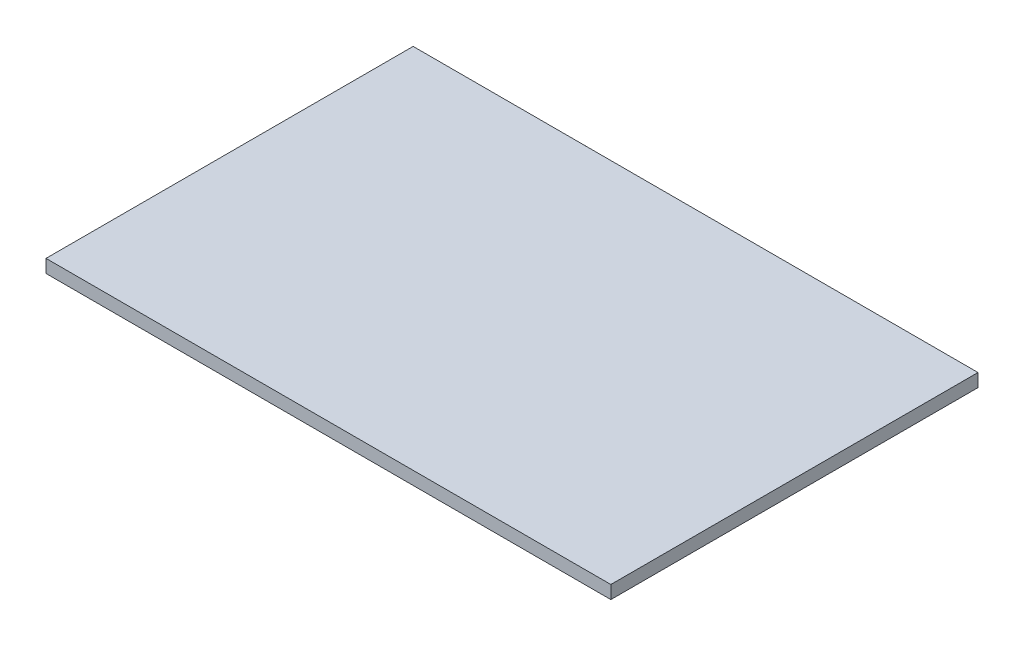
ISO-10303-21;
HEADER;
FILE_DESCRIPTION(('STEP AP214'),'2;1');
FILE_NAME('part.step','',(''),(''),'','','');
FILE_SCHEMA(('AUTOMOTIVE_DESIGN { 1 0 10303 214 1 1 1 1 }'));
ENDSEC;
DATA;
#1=APPLICATION_CONTEXT('core data for automotive mechanical design processes');
#2=APPLICATION_PROTOCOL_DEFINITION('international standard','automotive_design',2000,#1);
#3=PRODUCT_CONTEXT('',#1,'mechanical');
#4=PRODUCT('Part','Part','',(#3));
#5=PRODUCT_RELATED_PRODUCT_CATEGORY('part','',(#4));
#6=PRODUCT_DEFINITION_FORMATION('','',#4);
#7=PRODUCT_DEFINITION_CONTEXT('part definition',#1,'design');
#8=PRODUCT_DEFINITION('design','',#6,#7);
#9=PRODUCT_DEFINITION_SHAPE('','',#8);
#10=(LENGTH_UNIT() NAMED_UNIT(*) SI_UNIT(.MILLI.,.METRE.));
#11=(NAMED_UNIT(*) PLANE_ANGLE_UNIT() SI_UNIT($,.RADIAN.));
#12=(NAMED_UNIT(*) SI_UNIT($,.STERADIAN.) SOLID_ANGLE_UNIT());
#13=UNCERTAINTY_MEASURE_WITH_UNIT(LENGTH_MEASURE(1.E-05),#10,'distance_accuracy_value','');
#14=(GEOMETRIC_REPRESENTATION_CONTEXT(3) GLOBAL_UNCERTAINTY_ASSIGNED_CONTEXT((#13)) GLOBAL_UNIT_ASSIGNED_CONTEXT((#10,
#11,#12)) REPRESENTATION_CONTEXT('',''));
#15=CARTESIAN_POINT('',(0.,0.,0.));
#16=DIRECTION('',(0.,0.,1.));
#17=DIRECTION('',(1.,0.,0.));
#18=AXIS2_PLACEMENT_3D('',#15,#16,#17);
#19=CARTESIAN_POINT('',(0.,-0.7366,0.));
#20=DIRECTION('',(-1.,0.,0.));
#21=DIRECTION('',(0.,0.,1.));
#22=AXIS2_PLACEMENT_3D('',#19,#20,#21);
#23=PLANE('',#22);
#24=DIRECTION('',(0.,0.,1.));
#25=VECTOR('',#24,1.);
#26=CARTESIAN_POINT('',(0.,0.,0.));
#27=LINE('',#26,#25);
#28=CARTESIAN_POINT('',(0.,0.,-20.6375));
#29=VERTEX_POINT('',#28);
#30=CARTESIAN_POINT('',(0.,0.,0.));
#31=VERTEX_POINT('',#30);
#32=EDGE_CURVE('E99',#29,#31,#27,.T.);
#33=ORIENTED_EDGE('',*,*,#32,.F.);
#34=DIRECTION('',(0.,1.,0.));
#35=VECTOR('',#34,1.);
#36=CARTESIAN_POINT('',(0.,-0.7366,-20.6375));
#37=LINE('',#36,#35);
#38=CARTESIAN_POINT('',(0.,-0.7366,-20.6375));
#39=VERTEX_POINT('',#38);
#40=EDGE_CURVE('E11',#39,#29,#37,.T.);
#41=ORIENTED_EDGE('',*,*,#40,.F.);
#42=DIRECTION('',(0.,0.,1.));
#43=VECTOR('',#42,1.);
#44=CARTESIAN_POINT('',(0.,-0.7366,0.));
#45=LINE('',#44,#43);
#46=CARTESIAN_POINT('',(0.,-0.7366,0.));
#47=VERTEX_POINT('',#46);
#48=EDGE_CURVE('E93',#39,#47,#45,.T.);
#49=ORIENTED_EDGE('',*,*,#48,.T.);
#50=DIRECTION('',(0.,1.,0.));
#51=VECTOR('',#50,1.);
#52=CARTESIAN_POINT('',(0.,-0.7366,0.));
#53=LINE('',#52,#51);
#54=EDGE_CURVE('E38',#47,#31,#53,.T.);
#55=ORIENTED_EDGE('',*,*,#54,.T.);
#56=EDGE_LOOP('',(#33,#41,#49,#55));
#57=FACE_BOUND('',#56,.T.);
#58=ADVANCED_FACE('F35',(#57),#23,.T.);
#59=CARTESIAN_POINT('',(0.,-0.7366,-20.6375));
#60=DIRECTION('',(0.,0.,-1.));
#61=DIRECTION('',(-1.,0.,0.));
#62=AXIS2_PLACEMENT_3D('',#59,#60,#61);
#63=PLANE('',#62);
#64=DIRECTION('',(-1.,0.,0.));
#65=VECTOR('',#64,1.);
#66=CARTESIAN_POINT('',(0.,0.,-20.6375));
#67=LINE('',#66,#65);
#68=CARTESIAN_POINT('',(31.75,0.,-20.6375));
#69=VERTEX_POINT('',#68);
#70=EDGE_CURVE('E95',#69,#29,#67,.T.);
#71=ORIENTED_EDGE('',*,*,#70,.F.);
#72=DIRECTION('',(0.,1.,0.));
#73=VECTOR('',#72,1.);
#74=CARTESIAN_POINT('',(31.75,-0.7366,-20.6375));
#75=LINE('',#74,#73);
#76=CARTESIAN_POINT('',(31.75,-0.7366,-20.6375));
#77=VERTEX_POINT('',#76);
#78=EDGE_CURVE('E44',#77,#69,#75,.T.);
#79=ORIENTED_EDGE('',*,*,#78,.F.);
#80=DIRECTION('',(-1.,0.,0.));
#81=VECTOR('',#80,1.);
#82=CARTESIAN_POINT('',(0.,-0.7366,-20.6375));
#83=LINE('',#82,#81);
#84=EDGE_CURVE('E90',#77,#39,#83,.T.);
#85=ORIENTED_EDGE('',*,*,#84,.T.);
#86=ORIENTED_EDGE('',*,*,#40,.T.);
#87=EDGE_LOOP('',(#71,#79,#85,#86));
#88=FACE_BOUND('',#87,.T.);
#89=ADVANCED_FACE('F109',(#88),#63,.T.);
#90=CARTESIAN_POINT('',(31.75,-0.7366,0.));
#91=DIRECTION('',(1.,0.,0.));
#92=DIRECTION('',(0.,0.,-1.));
#93=AXIS2_PLACEMENT_3D('',#90,#91,#92);
#94=PLANE('',#93);
#95=DIRECTION('',(0.,0.,-1.));
#96=VECTOR('',#95,1.);
#97=CARTESIAN_POINT('',(31.75,0.,0.));
#98=LINE('',#97,#96);
#99=CARTESIAN_POINT('',(31.75,0.,0.));
#100=VERTEX_POINT('',#99);
#101=EDGE_CURVE('E85',#100,#69,#98,.T.);
#102=ORIENTED_EDGE('',*,*,#101,.F.);
#103=DIRECTION('',(0.,1.,0.));
#104=VECTOR('',#103,1.);
#105=CARTESIAN_POINT('',(31.75,-0.7366,0.));
#106=LINE('',#105,#104);
#107=CARTESIAN_POINT('',(31.75,-0.7366,0.));
#108=VERTEX_POINT('',#107);
#109=EDGE_CURVE('E80',#108,#100,#106,.T.);
#110=ORIENTED_EDGE('',*,*,#109,.F.);
#111=DIRECTION('',(0.,0.,-1.));
#112=VECTOR('',#111,1.);
#113=CARTESIAN_POINT('',(31.75,-0.7366,0.));
#114=LINE('',#113,#112);
#115=EDGE_CURVE('E83',#108,#77,#114,.T.);
#116=ORIENTED_EDGE('',*,*,#115,.T.);
#117=ORIENTED_EDGE('',*,*,#78,.T.);
#118=EDGE_LOOP('',(#102,#110,#116,#117));
#119=FACE_BOUND('',#118,.T.);
#120=ADVANCED_FACE('F82',(#119),#94,.T.);
#121=CARTESIAN_POINT('',(0.,-0.7366,0.));
#122=DIRECTION('',(0.,0.,1.));
#123=DIRECTION('',(1.,0.,0.));
#124=AXIS2_PLACEMENT_3D('',#121,#122,#123);
#125=PLANE('',#124);
#126=DIRECTION('',(1.,0.,0.));
#127=VECTOR('',#126,1.);
#128=CARTESIAN_POINT('',(0.,0.,0.));
#129=LINE('',#128,#127);
#130=EDGE_CURVE('E102',#31,#100,#129,.T.);
#131=ORIENTED_EDGE('',*,*,#130,.F.);
#132=ORIENTED_EDGE('',*,*,#54,.F.);
#133=DIRECTION('',(1.,0.,0.));
#134=VECTOR('',#133,1.);
#135=CARTESIAN_POINT('',(0.,-0.7366,0.));
#136=LINE('',#135,#134);
#137=EDGE_CURVE('E89',#47,#108,#136,.T.);
#138=ORIENTED_EDGE('',*,*,#137,.T.);
#139=ORIENTED_EDGE('',*,*,#109,.T.);
#140=EDGE_LOOP('',(#131,#132,#138,#139));
#141=FACE_BOUND('',#140,.T.);
#142=ADVANCED_FACE('F92',(#141),#125,.T.);
#143=CARTESIAN_POINT('',(0.,-0.7366,0.));
#144=DIRECTION('',(0.,-1.,0.));
#145=DIRECTION('',(0.,0.,-1.));
#146=AXIS2_PLACEMENT_3D('',#143,#144,#145);
#147=PLANE('',#146);
#148=ORIENTED_EDGE('',*,*,#48,.F.);
#149=ORIENTED_EDGE('',*,*,#84,.F.);
#150=ORIENTED_EDGE('',*,*,#115,.F.);
#151=ORIENTED_EDGE('',*,*,#137,.F.);
#152=EDGE_LOOP('',(#148,#149,#150,#151));
#153=FACE_BOUND('',#152,.T.);
#154=ADVANCED_FACE('F88',(#153),#147,.T.);
#155=CARTESIAN_POINT('',(0.,0.,0.));
#156=DIRECTION('',(0.,-1.,0.));
#157=DIRECTION('',(0.,0.,-1.));
#158=AXIS2_PLACEMENT_3D('',#155,#156,#157);
#159=PLANE('',#158);
#160=ORIENTED_EDGE('',*,*,#32,.T.);
#161=ORIENTED_EDGE('',*,*,#130,.T.);
#162=ORIENTED_EDGE('',*,*,#101,.T.);
#163=ORIENTED_EDGE('',*,*,#70,.T.);
#164=EDGE_LOOP('',(#160,#161,#162,#163));
#165=FACE_BOUND('',#164,.T.);
#166=ADVANCED_FACE('F108',(#165),#159,.F.);
#167=CLOSED_SHELL('',(#58,#89,#120,#142,#154,#166));
#168=MANIFOLD_SOLID_BREP('B2',#167);
#169=ADVANCED_BREP_SHAPE_REPRESENTATION('',(#18,#168),#14);
#170=SHAPE_DEFINITION_REPRESENTATION(#9,#169);
ENDSEC;
END-ISO-10303-21;
